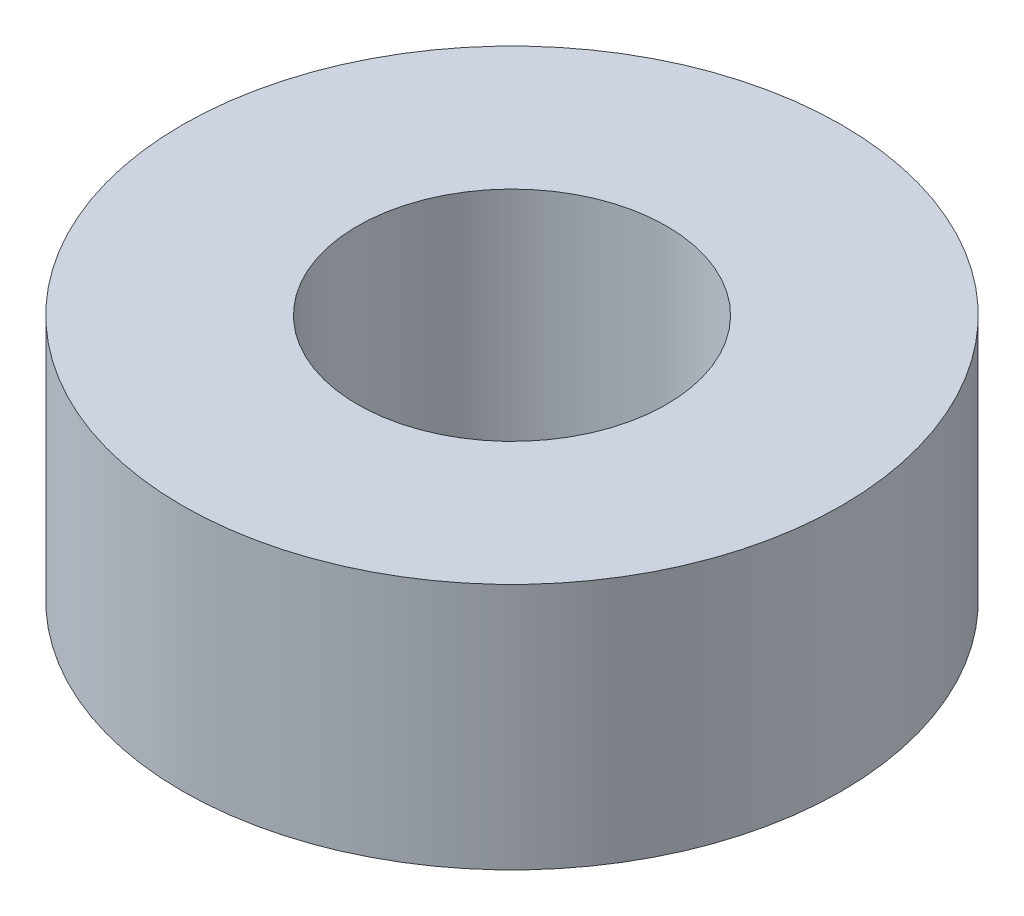
ISO-10303-21;
HEADER;
FILE_DESCRIPTION(('STEP AP214'),'2;1');
FILE_NAME('part.step','',(''),(''),'','','');
FILE_SCHEMA(('AUTOMOTIVE_DESIGN { 1 0 10303 214 1 1 1 1 }'));
ENDSEC;
DATA;
#1=APPLICATION_CONTEXT('core data for automotive mechanical design processes');
#2=APPLICATION_PROTOCOL_DEFINITION('international standard','automotive_design',2000,#1);
#3=PRODUCT_CONTEXT('',#1,'mechanical');
#4=PRODUCT('Part','Part','',(#3));
#5=PRODUCT_RELATED_PRODUCT_CATEGORY('part','',(#4));
#6=PRODUCT_DEFINITION_FORMATION('','',#4);
#7=PRODUCT_DEFINITION_CONTEXT('part definition',#1,'design');
#8=PRODUCT_DEFINITION('design','',#6,#7);
#9=PRODUCT_DEFINITION_SHAPE('','',#8);
#10=(LENGTH_UNIT() NAMED_UNIT(*) SI_UNIT(.MILLI.,.METRE.));
#11=(NAMED_UNIT(*) PLANE_ANGLE_UNIT() SI_UNIT($,.RADIAN.));
#12=(NAMED_UNIT(*) SI_UNIT($,.STERADIAN.) SOLID_ANGLE_UNIT());
#13=UNCERTAINTY_MEASURE_WITH_UNIT(LENGTH_MEASURE(1.E-05),#10,'distance_accuracy_value','');
#14=(GEOMETRIC_REPRESENTATION_CONTEXT(3) GLOBAL_UNCERTAINTY_ASSIGNED_CONTEXT((#13)) GLOBAL_UNIT_ASSIGNED_CONTEXT((#10,
#11,#12)) REPRESENTATION_CONTEXT('',''));
#15=CARTESIAN_POINT('',(0.,0.,0.));
#16=DIRECTION('',(0.,0.,1.));
#17=DIRECTION('',(1.,0.,0.));
#18=AXIS2_PLACEMENT_3D('',#15,#16,#17);
#19=CARTESIAN_POINT('',(0.,15.24,0.));
#20=DIRECTION('',(0.,1.,0.));
#21=DIRECTION('',(0.,0.,1.));
#22=AXIS2_PLACEMENT_3D('',#19,#20,#21);
#23=PLANE('',#22);
#24=CARTESIAN_POINT('',(0.,15.24,0.));
#25=DIRECTION('',(0.,1.,0.));
#26=DIRECTION('',(0.,0.,1.));
#27=AXIS2_PLACEMENT_3D('',#24,#25,#26);
#28=CIRCLE('',#27,20.32);
#29=CARTESIAN_POINT('',(0.,15.24,-20.32));
#30=VERTEX_POINT('',#29);
#31=EDGE_CURVE('E10',#30,#30,#28,.T.);
#32=ORIENTED_EDGE('',*,*,#31,.T.);
#33=EDGE_LOOP('',(#32));
#34=FACE_BOUND('',#33,.T.);
#35=CARTESIAN_POINT('',(0.,15.24,0.));
#36=DIRECTION('',(0.,1.,0.));
#37=DIRECTION('',(0.,0.,1.));
#38=AXIS2_PLACEMENT_3D('',#35,#36,#37);
#39=CIRCLE('',#38,9.525);
#40=CARTESIAN_POINT('',(0.,15.24,-9.525));
#41=VERTEX_POINT('',#40);
#42=EDGE_CURVE('E41',#41,#41,#39,.T.);
#43=ORIENTED_EDGE('',*,*,#42,.F.);
#44=EDGE_LOOP('',(#43));
#45=FACE_BOUND('',#44,.T.);
#46=ADVANCED_FACE('F30',(#34,#45),#23,.T.);
#47=CARTESIAN_POINT('',(0.,0.,0.));
#48=DIRECTION('',(0.,1.,0.));
#49=DIRECTION('',(0.,0.,1.));
#50=AXIS2_PLACEMENT_3D('',#47,#48,#49);
#51=PLANE('',#50);
#52=CARTESIAN_POINT('',(0.,0.,0.));
#53=DIRECTION('',(0.,1.,0.));
#54=DIRECTION('',(0.,0.,1.));
#55=AXIS2_PLACEMENT_3D('',#52,#53,#54);
#56=CIRCLE('',#55,20.32);
#57=CARTESIAN_POINT('',(0.,0.,-20.32));
#58=VERTEX_POINT('',#57);
#59=EDGE_CURVE('E34',#58,#58,#56,.T.);
#60=ORIENTED_EDGE('',*,*,#59,.F.);
#61=EDGE_LOOP('',(#60));
#62=FACE_BOUND('',#61,.T.);
#63=CARTESIAN_POINT('',(0.,0.,0.));
#64=DIRECTION('',(0.,1.,0.));
#65=DIRECTION('',(0.,0.,1.));
#66=AXIS2_PLACEMENT_3D('',#63,#64,#65);
#67=CIRCLE('',#66,9.525);
#68=CARTESIAN_POINT('',(0.,0.,-9.525));
#69=VERTEX_POINT('',#68);
#70=EDGE_CURVE('E43',#69,#69,#67,.T.);
#71=ORIENTED_EDGE('',*,*,#70,.T.);
#72=EDGE_LOOP('',(#71));
#73=FACE_BOUND('',#72,.T.);
#74=ADVANCED_FACE('F53',(#62,#73),#51,.F.);
#75=CARTESIAN_POINT('',(0.,15.24,0.));
#76=DIRECTION('',(0.,-1.,0.));
#77=DIRECTION('',(0.,0.,-1.));
#78=AXIS2_PLACEMENT_3D('',#75,#76,#77);
#79=CYLINDRICAL_SURFACE('',#78,20.32);
#80=CARTESIAN_POINT('',(0.,15.24,-20.32));
#81=CARTESIAN_POINT('',(0.,15.08125,-20.32));
#82=CARTESIAN_POINT('',(0.,14.9225,-20.32));
#83=CARTESIAN_POINT('',(0.,14.605,-20.32));
#84=CARTESIAN_POINT('',(0.,14.44625,-20.32));
#85=CARTESIAN_POINT('',(0.,14.12875,-20.32));
#86=CARTESIAN_POINT('',(0.,13.97,-20.32));
#87=CARTESIAN_POINT('',(0.,13.6525,-20.32));
#88=CARTESIAN_POINT('',(0.,13.49375,-20.32));
#89=CARTESIAN_POINT('',(0.,13.17625,-20.32));
#90=CARTESIAN_POINT('',(0.,13.0175,-20.32));
#91=CARTESIAN_POINT('',(0.,12.7,-20.32));
#92=CARTESIAN_POINT('',(0.,12.54125,-20.32));
#93=CARTESIAN_POINT('',(0.,12.22375,-20.32));
#94=CARTESIAN_POINT('',(0.,12.065,-20.32));
#95=CARTESIAN_POINT('',(0.,11.7475,-20.32));
#96=CARTESIAN_POINT('',(0.,11.58875,-20.32));
#97=CARTESIAN_POINT('',(0.,11.27125,-20.32));
#98=CARTESIAN_POINT('',(0.,11.1125,-20.32));
#99=CARTESIAN_POINT('',(0.,10.795,-20.32));
#100=CARTESIAN_POINT('',(0.,10.63625,-20.32));
#101=CARTESIAN_POINT('',(0.,10.31875,-20.32));
#102=CARTESIAN_POINT('',(0.,10.16,-20.32));
#103=CARTESIAN_POINT('',(0.,9.8425,-20.32));
#104=CARTESIAN_POINT('',(0.,9.68375,-20.32));
#105=CARTESIAN_POINT('',(0.,9.36625,-20.32));
#106=CARTESIAN_POINT('',(0.,9.2075,-20.32));
#107=CARTESIAN_POINT('',(0.,8.89,-20.32));
#108=CARTESIAN_POINT('',(0.,8.73125,-20.32));
#109=CARTESIAN_POINT('',(0.,8.41375,-20.32));
#110=CARTESIAN_POINT('',(0.,8.255,-20.32));
#111=CARTESIAN_POINT('',(0.,7.9375,-20.32));
#112=CARTESIAN_POINT('',(0.,7.77875,-20.32));
#113=CARTESIAN_POINT('',(0.,7.46125,-20.32));
#114=CARTESIAN_POINT('',(0.,7.3025,-20.32));
#115=CARTESIAN_POINT('',(0.,6.985,-20.32));
#116=CARTESIAN_POINT('',(0.,6.82625,-20.32));
#117=CARTESIAN_POINT('',(0.,6.50875,-20.32));
#118=CARTESIAN_POINT('',(0.,6.35,-20.32));
#119=CARTESIAN_POINT('',(0.,6.0325,-20.32));
#120=CARTESIAN_POINT('',(0.,5.87375,-20.32));
#121=CARTESIAN_POINT('',(0.,5.55625,-20.32));
#122=CARTESIAN_POINT('',(0.,5.3975,-20.32));
#123=CARTESIAN_POINT('',(0.,5.08,-20.32));
#124=CARTESIAN_POINT('',(0.,4.92125,-20.32));
#125=CARTESIAN_POINT('',(0.,4.60375,-20.32));
#126=CARTESIAN_POINT('',(0.,4.445,-20.32));
#127=CARTESIAN_POINT('',(0.,4.1275,-20.32));
#128=CARTESIAN_POINT('',(0.,3.96875,-20.32));
#129=CARTESIAN_POINT('',(0.,3.65125,-20.32));
#130=CARTESIAN_POINT('',(0.,3.4925,-20.32));
#131=CARTESIAN_POINT('',(0.,3.175,-20.32));
#132=CARTESIAN_POINT('',(0.,3.01625,-20.32));
#133=CARTESIAN_POINT('',(0.,2.69875,-20.32));
#134=CARTESIAN_POINT('',(0.,2.54,-20.32));
#135=CARTESIAN_POINT('',(0.,2.2225,-20.32));
#136=CARTESIAN_POINT('',(0.,2.06375,-20.32));
#137=CARTESIAN_POINT('',(0.,1.74625,-20.32));
#138=CARTESIAN_POINT('',(0.,1.5875,-20.32));
#139=CARTESIAN_POINT('',(0.,1.27,-20.32));
#140=CARTESIAN_POINT('',(0.,1.11125,-20.32));
#141=CARTESIAN_POINT('',(0.,0.79375,-20.32));
#142=CARTESIAN_POINT('',(0.,0.634999999999999,-20.32));
#143=CARTESIAN_POINT('',(0.,0.3175,-20.32));
#144=CARTESIAN_POINT('',(0.,0.15875,-20.32));
#145=CARTESIAN_POINT('',(0.,0.,-20.32));
#146=B_SPLINE_CURVE_WITH_KNOTS('',3,(#80,#81,#82,#83,#84,#85,#86,#87,#88,#89,#90,#91,#92,#93,
#94,#95,#96,#97,#98,#99,#100,#101,#102,#103,#104,#105,#106,#107,#108,#109,#110,#111,#112,#113,
#114,#115,#116,#117,#118,#119,#120,#121,#122,#123,#124,#125,#126,#127,#128,#129,#130,#131,#132,
#133,#134,#135,#136,#137,#138,#139,#140,#141,#142,#143,#144,#145),.UNSPECIFIED.,.F.,.F.,(4,2,2,
2,2,2,2,2,2,2,2,2,2,2,2,2,2,2,2,2,2,2,2,2,2,2,2,2,2,2,2,2,4),(0.,0.476250000000001,0.9525,
1.42875,1.905,2.38125,2.8575,3.33375,3.81,4.28625,4.7625,5.23875,5.715,6.19125,6.6675,7.14375,
7.62,8.09625,8.5725,9.04875,9.525,10.00125,10.4775,10.95375,11.43,11.90625,12.3825,12.85875,
13.335,13.81125,14.2875,14.76375,15.24),.UNSPECIFIED.);
#147=EDGE_CURVE('BSEAM32',#30,#58,#146,.T.);
#148=ORIENTED_EDGE('',*,*,#31,.F.);
#149=ORIENTED_EDGE('',*,*,#59,.T.);
#150=ORIENTED_EDGE('',*,*,#147,.T.);
#151=ORIENTED_EDGE('',*,*,#147,.F.);
#152=EDGE_LOOP('',(#148,#150,#149,#151));
#153=FACE_BOUND('',#152,.T.);
#154=ADVANCED_FACE('F32',(#153),#79,.T.);
#155=CARTESIAN_POINT('',(0.,15.24,0.));
#156=DIRECTION('',(0.,-1.,0.));
#157=DIRECTION('',(0.,0.,-1.));
#158=AXIS2_PLACEMENT_3D('',#155,#156,#157);
#159=CYLINDRICAL_SURFACE('',#158,9.525);
#160=CARTESIAN_POINT('',(0.,15.24,-9.525));
#161=CARTESIAN_POINT('',(0.,15.08125,-9.525));
#162=CARTESIAN_POINT('',(0.,14.9225,-9.525));
#163=CARTESIAN_POINT('',(0.,14.605,-9.525));
#164=CARTESIAN_POINT('',(0.,14.44625,-9.525));
#165=CARTESIAN_POINT('',(0.,14.12875,-9.525));
#166=CARTESIAN_POINT('',(0.,13.97,-9.525));
#167=CARTESIAN_POINT('',(0.,13.6525,-9.525));
#168=CARTESIAN_POINT('',(0.,13.49375,-9.525));
#169=CARTESIAN_POINT('',(0.,13.17625,-9.525));
#170=CARTESIAN_POINT('',(0.,13.0175,-9.525));
#171=CARTESIAN_POINT('',(0.,12.7,-9.525));
#172=CARTESIAN_POINT('',(0.,12.54125,-9.525));
#173=CARTESIAN_POINT('',(0.,12.22375,-9.525));
#174=CARTESIAN_POINT('',(0.,12.065,-9.525));
#175=CARTESIAN_POINT('',(0.,11.7475,-9.525));
#176=CARTESIAN_POINT('',(0.,11.58875,-9.525));
#177=CARTESIAN_POINT('',(0.,11.27125,-9.525));
#178=CARTESIAN_POINT('',(0.,11.1125,-9.525));
#179=CARTESIAN_POINT('',(0.,10.795,-9.525));
#180=CARTESIAN_POINT('',(0.,10.63625,-9.525));
#181=CARTESIAN_POINT('',(0.,10.31875,-9.525));
#182=CARTESIAN_POINT('',(0.,10.16,-9.525));
#183=CARTESIAN_POINT('',(0.,9.8425,-9.525));
#184=CARTESIAN_POINT('',(0.,9.68375,-9.525));
#185=CARTESIAN_POINT('',(0.,9.36625,-9.525));
#186=CARTESIAN_POINT('',(0.,9.2075,-9.525));
#187=CARTESIAN_POINT('',(0.,8.89,-9.525));
#188=CARTESIAN_POINT('',(0.,8.73125,-9.525));
#189=CARTESIAN_POINT('',(0.,8.41375,-9.525));
#190=CARTESIAN_POINT('',(0.,8.255,-9.525));
#191=CARTESIAN_POINT('',(0.,7.9375,-9.525));
#192=CARTESIAN_POINT('',(0.,7.77875,-9.525));
#193=CARTESIAN_POINT('',(0.,7.46125,-9.525));
#194=CARTESIAN_POINT('',(0.,7.3025,-9.525));
#195=CARTESIAN_POINT('',(0.,6.985,-9.525));
#196=CARTESIAN_POINT('',(0.,6.82625,-9.525));
#197=CARTESIAN_POINT('',(0.,6.50875,-9.525));
#198=CARTESIAN_POINT('',(0.,6.35,-9.525));
#199=CARTESIAN_POINT('',(0.,6.0325,-9.525));
#200=CARTESIAN_POINT('',(0.,5.87375,-9.525));
#201=CARTESIAN_POINT('',(0.,5.55625,-9.525));
#202=CARTESIAN_POINT('',(0.,5.3975,-9.525));
#203=CARTESIAN_POINT('',(0.,5.08,-9.525));
#204=CARTESIAN_POINT('',(0.,4.92125,-9.525));
#205=CARTESIAN_POINT('',(0.,4.60375,-9.525));
#206=CARTESIAN_POINT('',(0.,4.445,-9.525));
#207=CARTESIAN_POINT('',(0.,4.1275,-9.525));
#208=CARTESIAN_POINT('',(0.,3.96875,-9.525));
#209=CARTESIAN_POINT('',(0.,3.65125,-9.525));
#210=CARTESIAN_POINT('',(0.,3.4925,-9.525));
#211=CARTESIAN_POINT('',(0.,3.175,-9.525));
#212=CARTESIAN_POINT('',(0.,3.01625,-9.525));
#213=CARTESIAN_POINT('',(0.,2.69875,-9.525));
#214=CARTESIAN_POINT('',(0.,2.54,-9.525));
#215=CARTESIAN_POINT('',(0.,2.2225,-9.525));
#216=CARTESIAN_POINT('',(0.,2.06375,-9.525));
#217=CARTESIAN_POINT('',(0.,1.74625,-9.525));
#218=CARTESIAN_POINT('',(0.,1.5875,-9.525));
#219=CARTESIAN_POINT('',(0.,1.27,-9.525));
#220=CARTESIAN_POINT('',(0.,1.11125,-9.525));
#221=CARTESIAN_POINT('',(0.,0.79375,-9.525));
#222=CARTESIAN_POINT('',(0.,0.634999999999999,-9.525));
#223=CARTESIAN_POINT('',(0.,0.3175,-9.525));
#224=CARTESIAN_POINT('',(0.,0.15875,-9.525));
#225=CARTESIAN_POINT('',(0.,0.,-9.525));
#226=B_SPLINE_CURVE_WITH_KNOTS('',3,(#160,#161,#162,#163,#164,#165,#166,#167,#168,#169,#170,
#171,#172,#173,#174,#175,#176,#177,#178,#179,#180,#181,#182,#183,#184,#185,#186,#187,#188,#189,
#190,#191,#192,#193,#194,#195,#196,#197,#198,#199,#200,#201,#202,#203,#204,#205,#206,#207,#208,
#209,#210,#211,#212,#213,#214,#215,#216,#217,#218,#219,#220,#221,#222,#223,#224,#225),
.UNSPECIFIED.,.F.,.F.,(4,2,2,2,2,2,2,2,2,2,2,2,2,2,2,2,2,2,2,2,2,2,2,2,2,2,2,2,2,2,2,2,4),(0.,
0.476249999999999,0.952499999999998,1.42875,1.905,2.38125,2.8575,3.33375,3.81,4.28625,4.7625,
5.23875,5.715,6.19125,6.6675,7.14375,7.62,8.09625,8.5725,9.04875,9.525,10.00125,10.4775,
10.95375,11.43,11.90625,12.3825,12.85875,13.335,13.81125,14.2875,14.76375,15.24),.UNSPECIFIED.);
#227=EDGE_CURVE('BSEAM49',#41,#69,#226,.T.);
#228=ORIENTED_EDGE('',*,*,#42,.T.);
#229=ORIENTED_EDGE('',*,*,#70,.F.);
#230=ORIENTED_EDGE('',*,*,#227,.T.);
#231=ORIENTED_EDGE('',*,*,#227,.F.);
#232=EDGE_LOOP('',(#228,#230,#229,#231));
#233=FACE_BOUND('',#232,.T.);
#234=ADVANCED_FACE('F49',(#233),#159,.F.);
#235=CLOSED_SHELL('',(#46,#74,#154,#234));
#236=MANIFOLD_SOLID_BREP('B2',#235);
#237=ADVANCED_BREP_SHAPE_REPRESENTATION('',(#18,#236),#14);
#238=SHAPE_DEFINITION_REPRESENTATION(#9,#237);
ENDSEC;
END-ISO-10303-21;
